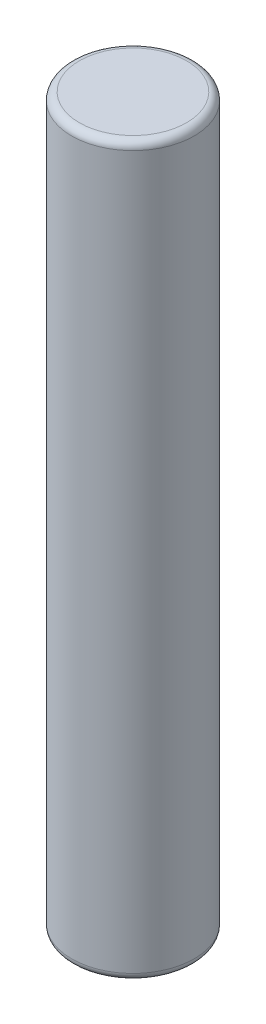
ISO-10303-21;
HEADER;
FILE_DESCRIPTION(('STEP AP214'),'2;1');
FILE_NAME('part.step','',(''),(''),'','','');
FILE_SCHEMA(('AUTOMOTIVE_DESIGN { 1 0 10303 214 1 1 1 1 }'));
ENDSEC;
DATA;
#1=APPLICATION_CONTEXT('core data for automotive mechanical design processes');
#2=APPLICATION_PROTOCOL_DEFINITION('international standard','automotive_design',2000,#1);
#3=PRODUCT_CONTEXT('',#1,'mechanical');
#4=PRODUCT('Part','Part','',(#3));
#5=PRODUCT_RELATED_PRODUCT_CATEGORY('part','',(#4));
#6=PRODUCT_DEFINITION_FORMATION('','',#4);
#7=PRODUCT_DEFINITION_CONTEXT('part definition',#1,'design');
#8=PRODUCT_DEFINITION('design','',#6,#7);
#9=PRODUCT_DEFINITION_SHAPE('','',#8);
#10=(LENGTH_UNIT() NAMED_UNIT(*) SI_UNIT(.MILLI.,.METRE.));
#11=(NAMED_UNIT(*) PLANE_ANGLE_UNIT() SI_UNIT($,.RADIAN.));
#12=(NAMED_UNIT(*) SI_UNIT($,.STERADIAN.) SOLID_ANGLE_UNIT());
#13=UNCERTAINTY_MEASURE_WITH_UNIT(LENGTH_MEASURE(1.E-05),#10,'distance_accuracy_value','');
#14=(GEOMETRIC_REPRESENTATION_CONTEXT(3) GLOBAL_UNCERTAINTY_ASSIGNED_CONTEXT((#13)) GLOBAL_UNIT_ASSIGNED_CONTEXT((#10,
#11,#12)) REPRESENTATION_CONTEXT('',''));
#15=CARTESIAN_POINT('',(0.,0.,0.));
#16=DIRECTION('',(0.,0.,1.));
#17=DIRECTION('',(1.,0.,0.));
#18=AXIS2_PLACEMENT_3D('',#15,#16,#17);
#19=CARTESIAN_POINT('',(0.,9.5,0.));
#20=DIRECTION('',(0.,-1.,0.));
#21=DIRECTION('',(0.,0.,-1.));
#22=AXIS2_PLACEMENT_3D('',#19,#20,#21);
#23=CYLINDRICAL_SURFACE('',#22,0.8);
#24=CARTESIAN_POINT('',(0.,9.4,0.));
#25=DIRECTION('',(0.,1.,0.));
#26=DIRECTION('',(0.,0.,1.));
#27=AXIS2_PLACEMENT_3D('',#24,#25,#26);
#28=CIRCLE('',#27,0.8);
#29=CARTESIAN_POINT('',(0.,9.4,0.8));
#30=VERTEX_POINT('',#29);
#31=EDGE_CURVE('E38',#30,#30,#28,.F.);
#32=ORIENTED_EDGE('',*,*,#31,.T.);
#33=EDGE_LOOP('',(#32));
#34=FACE_BOUND('',#33,.T.);
#35=CARTESIAN_POINT('',(0.,0.0999999999999994,0.));
#36=DIRECTION('',(0.,1.,0.));
#37=DIRECTION('',(0.,0.,1.));
#38=AXIS2_PLACEMENT_3D('',#35,#36,#37);
#39=CIRCLE('',#38,0.8);
#40=CARTESIAN_POINT('',(0.,0.0999999999999994,0.8));
#41=VERTEX_POINT('',#40);
#42=EDGE_CURVE('E42',#41,#41,#39,.T.);
#43=ORIENTED_EDGE('',*,*,#42,.T.);
#44=EDGE_LOOP('',(#43));
#45=FACE_BOUND('',#44,.T.);
#46=ADVANCED_FACE('F31',(#34,#45),#23,.T.);
#47=CARTESIAN_POINT('',(0.,9.5,0.));
#48=DIRECTION('',(0.,1.,0.));
#49=DIRECTION('',(0.,0.,1.));
#50=AXIS2_PLACEMENT_3D('',#47,#48,#49);
#51=PLANE('',#50);
#52=CARTESIAN_POINT('',(0.,9.5,0.));
#53=DIRECTION('',(0.,1.,0.));
#54=DIRECTION('',(0.,0.,1.));
#55=AXIS2_PLACEMENT_3D('',#52,#53,#54);
#56=CIRCLE('',#55,0.7);
#57=CARTESIAN_POINT('',(0.,9.5,0.7));
#58=VERTEX_POINT('',#57);
#59=EDGE_CURVE('E46',#58,#58,#56,.T.);
#60=ORIENTED_EDGE('',*,*,#59,.T.);
#61=EDGE_LOOP('',(#60));
#62=FACE_BOUND('',#61,.T.);
#63=ADVANCED_FACE('F52',(#62),#51,.T.);
#64=CARTESIAN_POINT('',(0.,0.,0.));
#65=DIRECTION('',(0.,1.,0.));
#66=DIRECTION('',(0.,0.,1.));
#67=AXIS2_PLACEMENT_3D('',#64,#65,#66);
#68=PLANE('',#67);
#69=CARTESIAN_POINT('',(0.,0.,0.));
#70=DIRECTION('',(0.,1.,0.));
#71=DIRECTION('',(0.,0.,1.));
#72=AXIS2_PLACEMENT_3D('',#69,#70,#71);
#73=CIRCLE('',#72,0.7);
#74=CARTESIAN_POINT('',(0.,0.,0.7));
#75=VERTEX_POINT('',#74);
#76=EDGE_CURVE('E10',#75,#75,#73,.F.);
#77=ORIENTED_EDGE('',*,*,#76,.T.);
#78=EDGE_LOOP('',(#77));
#79=FACE_BOUND('',#78,.T.);
#80=ADVANCED_FACE('F56',(#79),#68,.F.);
#81=CARTESIAN_POINT('',(0.,9.4,0.));
#82=DIRECTION('',(0.,1.,0.));
#83=DIRECTION('',(0.,0.,1.));
#84=AXIS2_PLACEMENT_3D('',#81,#82,#83);
#85=TOROIDAL_SURFACE('',#84,0.7,0.1);
#86=ORIENTED_EDGE('',*,*,#31,.F.);
#87=EDGE_LOOP('',(#86));
#88=FACE_BOUND('',#87,.T.);
#89=ORIENTED_EDGE('',*,*,#59,.F.);
#90=EDGE_LOOP('',(#89));
#91=FACE_BOUND('',#90,.T.);
#92=ADVANCED_FACE('F54',(#88,#91),#85,.T.);
#93=CARTESIAN_POINT('',(0.,0.0999999999999994,0.));
#94=DIRECTION('',(0.,1.,0.));
#95=DIRECTION('',(0.,0.,1.));
#96=AXIS2_PLACEMENT_3D('',#93,#94,#95);
#97=TOROIDAL_SURFACE('',#96,0.7,0.1);
#98=ORIENTED_EDGE('',*,*,#76,.F.);
#99=EDGE_LOOP('',(#98));
#100=FACE_BOUND('',#99,.T.);
#101=ORIENTED_EDGE('',*,*,#42,.F.);
#102=EDGE_LOOP('',(#101));
#103=FACE_BOUND('',#102,.T.);
#104=ADVANCED_FACE('F33',(#100,#103),#97,.T.);
#105=CLOSED_SHELL('',(#46,#63,#80,#92,#104));
#106=MANIFOLD_SOLID_BREP('B2',#105);
#107=ADVANCED_BREP_SHAPE_REPRESENTATION('',(#18,#106),#14);
#108=SHAPE_DEFINITION_REPRESENTATION(#9,#107);
ENDSEC;
END-ISO-10303-21;
